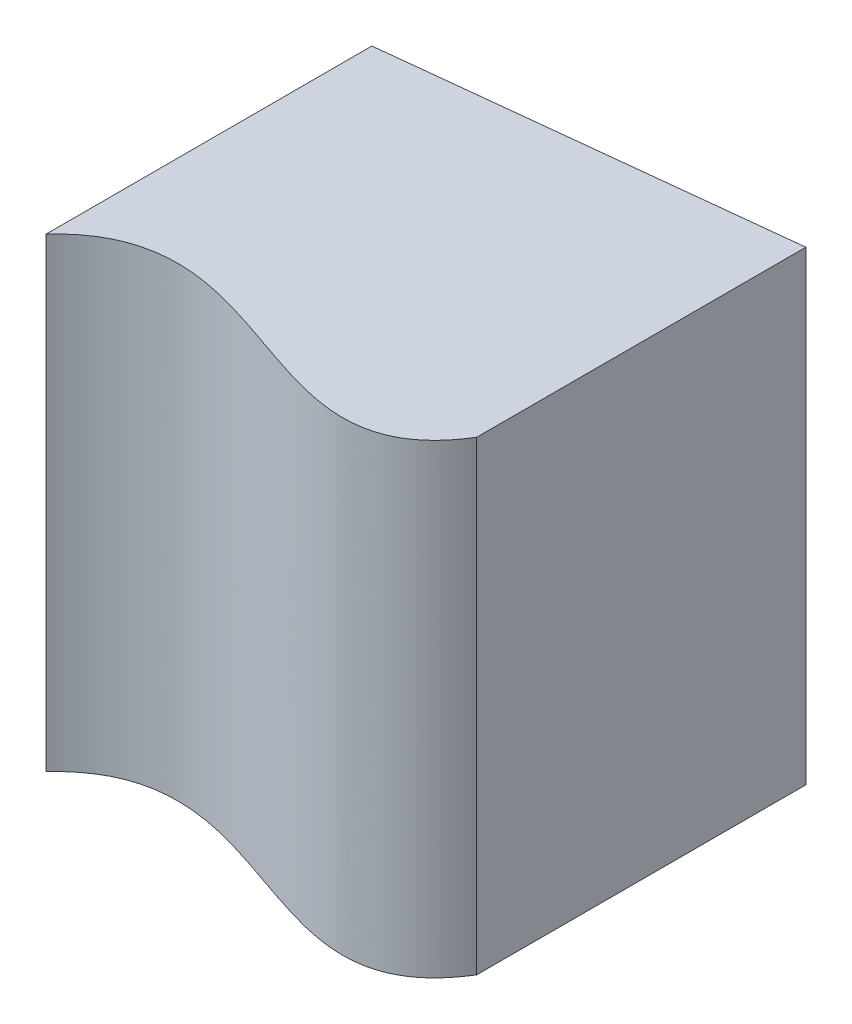
ISO-10303-21;
HEADER;
FILE_DESCRIPTION(('STEP AP214'),'2;1');
FILE_NAME('part.step','',(''),(''),'','','');
FILE_SCHEMA(('AUTOMOTIVE_DESIGN { 1 0 10303 214 1 1 1 1 }'));
ENDSEC;
DATA;
#1=APPLICATION_CONTEXT('core data for automotive mechanical design processes');
#2=APPLICATION_PROTOCOL_DEFINITION('international standard','automotive_design',2000,#1);
#3=PRODUCT_CONTEXT('',#1,'mechanical');
#4=PRODUCT('Part','Part','',(#3));
#5=PRODUCT_RELATED_PRODUCT_CATEGORY('part','',(#4));
#6=PRODUCT_DEFINITION_FORMATION('','',#4);
#7=PRODUCT_DEFINITION_CONTEXT('part definition',#1,'design');
#8=PRODUCT_DEFINITION('design','',#6,#7);
#9=PRODUCT_DEFINITION_SHAPE('','',#8);
#10=(LENGTH_UNIT() NAMED_UNIT(*) SI_UNIT(.MILLI.,.METRE.));
#11=(NAMED_UNIT(*) PLANE_ANGLE_UNIT() SI_UNIT($,.RADIAN.));
#12=(NAMED_UNIT(*) SI_UNIT($,.STERADIAN.) SOLID_ANGLE_UNIT());
#13=UNCERTAINTY_MEASURE_WITH_UNIT(LENGTH_MEASURE(1.E-05),#10,'distance_accuracy_value','');
#14=(GEOMETRIC_REPRESENTATION_CONTEXT(3) GLOBAL_UNCERTAINTY_ASSIGNED_CONTEXT((#13)) GLOBAL_UNIT_ASSIGNED_CONTEXT((#10,
#11,#12)) REPRESENTATION_CONTEXT('',''));
#15=CARTESIAN_POINT('',(0.,0.,0.));
#16=DIRECTION('',(0.,0.,1.));
#17=DIRECTION('',(1.,0.,0.));
#18=AXIS2_PLACEMENT_3D('',#15,#16,#17);
#19=CARTESIAN_POINT('',(-76.8379041280091,131.5,58.8168722497488));
#20=CARTESIAN_POINT('',(-9.54174997439143,131.5,-14.7823401101638));
#21=CARTESIAN_POINT('',(93.3590680038237,131.5,119.986931912893));
#22=CARTESIAN_POINT('',(144.166689092162,131.5,36.5971649553993));
#23=B_SPLINE_CURVE_WITH_KNOTS('',3,(#19,#20,#21,#22),.UNSPECIFIED.,.F.,.F.,(4,4),(0.,1.),.UNSPECIFIED.);
#24=DIRECTION('',(0.,-1.,0.));
#25=VECTOR('',#24,1.);
#26=SURFACE_OF_LINEAR_EXTRUSION('',#23,#25);
#27=CARTESIAN_POINT('',(-76.8379041280091,-131.5,58.8168722497488));
#28=CARTESIAN_POINT('',(-9.54174997439143,-131.5,-14.7823401101638));
#29=CARTESIAN_POINT('',(93.3590680038237,-131.5,119.986931912893));
#30=CARTESIAN_POINT('',(144.166689092162,-131.5,36.5971649553993));
#31=B_SPLINE_CURVE_WITH_KNOTS('',3,(#27,#28,#29,#30),.UNSPECIFIED.,.F.,.F.,(4,4),(0.,1.),.UNSPECIFIED.);
#32=CARTESIAN_POINT('',(-76.8379041280091,-131.5,58.8168722497488));
#33=VERTEX_POINT('',#32);
#34=CARTESIAN_POINT('',(144.166689092162,-131.5,36.5971649553993));
#35=VERTEX_POINT('',#34);
#36=EDGE_CURVE('E100',#33,#35,#31,.T.);
#37=ORIENTED_EDGE('',*,*,#36,.T.);
#38=DIRECTION('',(0.,-1.,0.));
#39=VECTOR('',#38,1.);
#40=CARTESIAN_POINT('',(144.166689092162,131.5,36.5971649553993));
#41=LINE('',#40,#39);
#42=CARTESIAN_POINT('',(144.166689092162,131.5,36.5971649553993));
#43=VERTEX_POINT('',#42);
#44=EDGE_CURVE('E11',#43,#35,#41,.T.);
#45=ORIENTED_EDGE('',*,*,#44,.F.);
#46=CARTESIAN_POINT('',(-76.8379041280091,131.5,58.8168722497488));
#47=VERTEX_POINT('',#46);
#48=EDGE_CURVE('E89',#47,#43,#23,.T.);
#49=ORIENTED_EDGE('',*,*,#48,.F.);
#50=DIRECTION('',(0.,-1.,0.));
#51=VECTOR('',#50,1.);
#52=CARTESIAN_POINT('',(-76.8379041280091,131.5,58.8168722497488));
#53=LINE('',#52,#51);
#54=EDGE_CURVE('E97',#47,#33,#53,.T.);
#55=ORIENTED_EDGE('',*,*,#54,.T.);
#56=EDGE_LOOP('',(#37,#45,#49,#55));
#57=FACE_BOUND('',#56,.T.);
#58=ADVANCED_FACE('F37',(#57),#26,.F.);
#59=CARTESIAN_POINT('',(144.166689092162,131.5,-149.34537247769));
#60=DIRECTION('',(-1.,0.,0.));
#61=DIRECTION('',(0.,0.,1.));
#62=AXIS2_PLACEMENT_3D('',#59,#60,#61);
#63=PLANE('',#62);
#64=DIRECTION('',(0.,0.,-1.));
#65=VECTOR('',#64,1.);
#66=CARTESIAN_POINT('',(144.166689092162,-131.5,-149.34537247769));
#67=LINE('',#66,#65);
#68=CARTESIAN_POINT('',(144.166689092162,-131.5,-149.34537247769));
#69=VERTEX_POINT('',#68);
#70=EDGE_CURVE('E93',#35,#69,#67,.T.);
#71=ORIENTED_EDGE('',*,*,#70,.T.);
#72=DIRECTION('',(0.,-1.,0.));
#73=VECTOR('',#72,1.);
#74=CARTESIAN_POINT('',(144.166689092162,131.5,-149.34537247769));
#75=LINE('',#74,#73);
#76=CARTESIAN_POINT('',(144.166689092162,131.5,-149.34537247769));
#77=VERTEX_POINT('',#76);
#78=EDGE_CURVE('E46',#77,#69,#75,.T.);
#79=ORIENTED_EDGE('',*,*,#78,.F.);
#80=DIRECTION('',(0.,0.,-1.));
#81=VECTOR('',#80,1.);
#82=CARTESIAN_POINT('',(144.166689092162,131.5,-149.34537247769));
#83=LINE('',#82,#81);
#84=EDGE_CURVE('E84',#43,#77,#83,.T.);
#85=ORIENTED_EDGE('',*,*,#84,.F.);
#86=ORIENTED_EDGE('',*,*,#44,.T.);
#87=EDGE_LOOP('',(#71,#79,#85,#86));
#88=FACE_BOUND('',#87,.T.);
#89=ADVANCED_FACE('F92',(#88),#63,.F.);
#90=CARTESIAN_POINT('',(-76.8379041280091,131.5,-125.199371519945));
#91=DIRECTION('',(0.108609351190115,0.,0.994084507893601));
#92=DIRECTION('',(0.994084507893601,0.,-0.108609351190115));
#93=AXIS2_PLACEMENT_3D('',#90,#91,#92);
#94=PLANE('',#93);
#95=DIRECTION('',(-0.994084507893601,0.,0.108609351190115));
#96=VECTOR('',#95,1.);
#97=CARTESIAN_POINT('',(-76.8379041280091,-131.5,-125.199371519945));
#98=LINE('',#97,#96);
#99=CARTESIAN_POINT('',(-76.8379041280091,-131.5,-125.199371519945));
#100=VERTEX_POINT('',#99);
#101=EDGE_CURVE('E71',#69,#100,#98,.T.);
#102=ORIENTED_EDGE('',*,*,#101,.T.);
#103=DIRECTION('',(0.,-1.,0.));
#104=VECTOR('',#103,1.);
#105=CARTESIAN_POINT('',(-76.8379041280091,131.5,-125.199371519945));
#106=LINE('',#105,#104);
#107=CARTESIAN_POINT('',(-76.8379041280091,131.5,-125.199371519945));
#108=VERTEX_POINT('',#107);
#109=EDGE_CURVE('E94',#108,#100,#106,.T.);
#110=ORIENTED_EDGE('',*,*,#109,.F.);
#111=DIRECTION('',(-0.994084507893601,0.,0.108609351190115));
#112=VECTOR('',#111,1.);
#113=CARTESIAN_POINT('',(-76.8379041280091,131.5,-125.199371519945));
#114=LINE('',#113,#112);
#115=EDGE_CURVE('E87',#77,#108,#114,.T.);
#116=ORIENTED_EDGE('',*,*,#115,.F.);
#117=ORIENTED_EDGE('',*,*,#78,.T.);
#118=EDGE_LOOP('',(#102,#110,#116,#117));
#119=FACE_BOUND('',#118,.T.);
#120=ADVANCED_FACE('F95',(#119),#94,.F.);
#121=CARTESIAN_POINT('',(-76.8379041280091,131.5,58.8168722497488));
#122=DIRECTION('',(1.,0.,0.));
#123=DIRECTION('',(0.,0.,-1.));
#124=AXIS2_PLACEMENT_3D('',#121,#122,#123);
#125=PLANE('',#124);
#126=DIRECTION('',(0.,0.,1.));
#127=VECTOR('',#126,1.);
#128=CARTESIAN_POINT('',(-76.8379041280091,-131.5,58.8168722497488));
#129=LINE('',#128,#127);
#130=EDGE_CURVE('E77',#100,#33,#129,.T.);
#131=ORIENTED_EDGE('',*,*,#130,.T.);
#132=ORIENTED_EDGE('',*,*,#54,.F.);
#133=DIRECTION('',(0.,0.,1.));
#134=VECTOR('',#133,1.);
#135=CARTESIAN_POINT('',(-76.8379041280091,131.5,58.8168722497488));
#136=LINE('',#135,#134);
#137=EDGE_CURVE('E54',#108,#47,#136,.T.);
#138=ORIENTED_EDGE('',*,*,#137,.F.);
#139=ORIENTED_EDGE('',*,*,#109,.T.);
#140=EDGE_LOOP('',(#131,#132,#138,#139));
#141=FACE_BOUND('',#140,.T.);
#142=ADVANCED_FACE('F112',(#141),#125,.F.);
#143=CARTESIAN_POINT('',(39.8475923815562,131.5,51.3784765766668));
#144=DIRECTION('',(0.,1.,0.));
#145=DIRECTION('',(0.,0.,1.));
#146=AXIS2_PLACEMENT_3D('',#143,#144,#145);
#147=PLANE('',#146);
#148=ORIENTED_EDGE('',*,*,#48,.T.);
#149=ORIENTED_EDGE('',*,*,#84,.T.);
#150=ORIENTED_EDGE('',*,*,#115,.T.);
#151=ORIENTED_EDGE('',*,*,#137,.T.);
#152=EDGE_LOOP('',(#148,#149,#150,#151));
#153=FACE_BOUND('',#152,.T.);
#154=ADVANCED_FACE('F85',(#153),#147,.T.);
#155=CARTESIAN_POINT('',(39.8475923815562,-131.5,51.3784765766668));
#156=DIRECTION('',(0.,1.,0.));
#157=DIRECTION('',(0.,0.,1.));
#158=AXIS2_PLACEMENT_3D('',#155,#156,#157);
#159=PLANE('',#158);
#160=ORIENTED_EDGE('',*,*,#36,.F.);
#161=ORIENTED_EDGE('',*,*,#130,.F.);
#162=ORIENTED_EDGE('',*,*,#101,.F.);
#163=ORIENTED_EDGE('',*,*,#70,.F.);
#164=EDGE_LOOP('',(#160,#161,#162,#163));
#165=FACE_BOUND('',#164,.T.);
#166=ADVANCED_FACE('F115',(#165),#159,.F.);
#167=CLOSED_SHELL('',(#58,#89,#120,#142,#154,#166));
#168=MANIFOLD_SOLID_BREP('B2',#167);
#169=ADVANCED_BREP_SHAPE_REPRESENTATION('',(#18,#168),#14);
#170=SHAPE_DEFINITION_REPRESENTATION(#9,#169);
ENDSEC;
END-ISO-10303-21;
